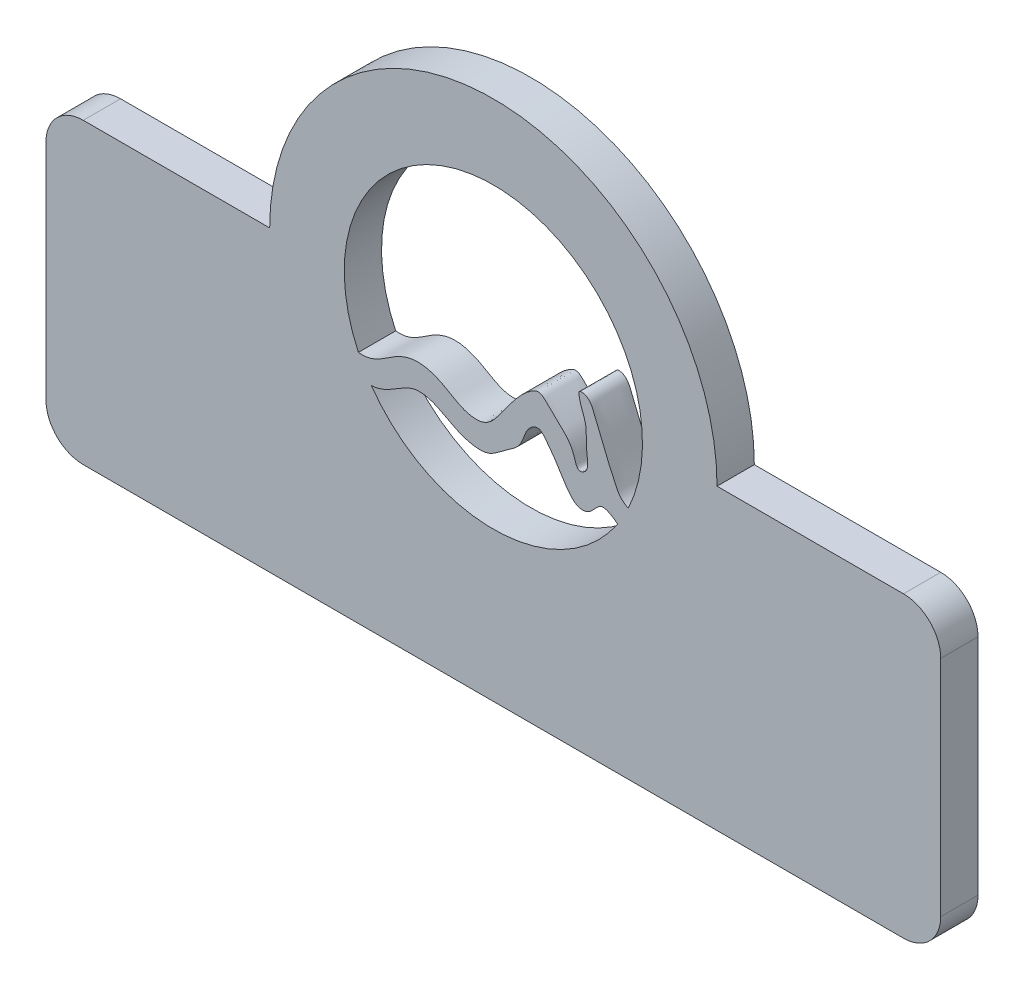
ISO-10303-21;
HEADER;
FILE_DESCRIPTION(('STEP AP214'),'2;1');
FILE_NAME('part.step','',(''),(''),'','','');
FILE_SCHEMA(('AUTOMOTIVE_DESIGN { 1 0 10303 214 1 1 1 1 }'));
ENDSEC;
DATA;
#1=APPLICATION_CONTEXT('core data for automotive mechanical design processes');
#2=APPLICATION_PROTOCOL_DEFINITION('international standard','automotive_design',2000,#1);
#3=PRODUCT_CONTEXT('',#1,'mechanical');
#4=PRODUCT('Part','Part','',(#3));
#5=PRODUCT_RELATED_PRODUCT_CATEGORY('part','',(#4));
#6=PRODUCT_DEFINITION_FORMATION('','',#4);
#7=PRODUCT_DEFINITION_CONTEXT('part definition',#1,'design');
#8=PRODUCT_DEFINITION('design','',#6,#7);
#9=PRODUCT_DEFINITION_SHAPE('','',#8);
#10=(LENGTH_UNIT() NAMED_UNIT(*) SI_UNIT(.MILLI.,.METRE.));
#11=(NAMED_UNIT(*) PLANE_ANGLE_UNIT() SI_UNIT($,.RADIAN.));
#12=(NAMED_UNIT(*) SI_UNIT($,.STERADIAN.) SOLID_ANGLE_UNIT());
#13=UNCERTAINTY_MEASURE_WITH_UNIT(LENGTH_MEASURE(1.E-05),#10,'distance_accuracy_value','');
#14=(GEOMETRIC_REPRESENTATION_CONTEXT(3) GLOBAL_UNCERTAINTY_ASSIGNED_CONTEXT((#13)) GLOBAL_UNIT_ASSIGNED_CONTEXT((#10,
#11,#12)) REPRESENTATION_CONTEXT('',''));
#15=CARTESIAN_POINT('',(0.,0.,0.));
#16=DIRECTION('',(0.,0.,1.));
#17=DIRECTION('',(1.,0.,0.));
#18=AXIS2_PLACEMENT_3D('',#15,#16,#17);
#19=CARTESIAN_POINT('',(16.7353149695587,16.1394582768876,3.175));
#20=DIRECTION('',(0.,0.,1.));
#21=DIRECTION('',(1.,0.,0.));
#22=AXIS2_PLACEMENT_3D('',#19,#20,#21);
#23=PLANE('',#22);
#24=CARTESIAN_POINT('',(16.7353149695587,16.1394582768876,3.175));
#25=DIRECTION('',(0.,0.,1.));
#26=DIRECTION('',(1.,0.,0.));
#27=AXIS2_PLACEMENT_3D('',#24,#25,#26);
#28=CIRCLE('',#27,12.7);
#29=CARTESIAN_POINT('',(28.2284558404309,10.7359674679487,3.175));
#30=VERTEX_POINT('',#29);
#31=CARTESIAN_POINT('',(5.24217409868645,10.7359674679487,3.175));
#32=VERTEX_POINT('',#31);
#33=EDGE_CURVE('E172',#30,#32,#28,.T.);
#34=ORIENTED_EDGE('',*,*,#33,.F.);
#35=CARTESIAN_POINT('',(5.24217409868645,10.7359674679487,3.175));
#36=CARTESIAN_POINT('',(6.71809569007158,10.5583363116698,3.175));
#37=CARTESIAN_POINT('',(7.9181175137713,12.0334760895931,3.175));
#38=CARTESIAN_POINT('',(10.468854721958,12.7659447435013,3.175));
#39=CARTESIAN_POINT('',(12.4429037284296,12.0981408705217,3.175));
#40=CARTESIAN_POINT('',(14.0399826679159,10.9310546034412,3.175));
#41=CARTESIAN_POINT('',(16.2263714118939,10.6185513462935,3.175));
#42=CARTESIAN_POINT('',(17.4991508982318,12.5178776573258,3.175));
#43=CARTESIAN_POINT('',(18.6877190372775,14.1014583521492,3.175));
#44=CARTESIAN_POINT('',(19.6579399153575,15.1072457767917,3.175));
#45=CARTESIAN_POINT('',(20.7365942091424,15.6711403370614,3.175));
#46=CARTESIAN_POINT('',(21.5924143850138,14.6574307728109,3.175));
#47=CARTESIAN_POINT('',(22.7185605146398,13.7475085461238,3.175));
#48=CARTESIAN_POINT('',(23.5698295134374,12.7032800384112,3.175));
#49=CARTESIAN_POINT('',(23.8625939485116,11.2745807664498,3.175));
#50=CARTESIAN_POINT('',(24.9533623804991,11.6978195279501,3.175));
#51=CARTESIAN_POINT('',(24.5406586001507,13.3497868624274,3.175));
#52=CARTESIAN_POINT('',(24.8082580394684,15.1397570692778,3.175));
#53=CARTESIAN_POINT('',(24.0950168556002,16.3011618970305,3.175));
#54=CARTESIAN_POINT('',(23.998924349624,17.331566415853,3.175));
#55=CARTESIAN_POINT('',(24.9340287374693,17.3133291685318,3.175));
#56=CARTESIAN_POINT('',(25.3682131220015,16.0394970111106,3.175));
#57=CARTESIAN_POINT('',(25.9914607242334,14.7264604105497,3.175));
#58=CARTESIAN_POINT('',(26.4067642072258,13.484600274914,3.175));
#59=CARTESIAN_POINT('',(27.1285210517247,12.1460637718713,3.175));
#60=CARTESIAN_POINT('',(27.3699983663483,11.1039666920429,3.175));
#61=CARTESIAN_POINT('',(28.2284558404309,10.7359674679487,3.175));
#62=B_SPLINE_CURVE_WITH_KNOTS('',3,(#35,#36,#37,#38,#39,#40,#41,#42,#43,#44,#45,#46,#47,#48,#49,
#50,#51,#52,#53,#54,#55,#56,#57,#58,#59,#60,#61),.UNSPECIFIED.,.F.,.F.,(4,1,1,1,1,1,1,1,1,1,1,1,
1,1,1,1,1,1,1,1,1,1,1,1,4),(0.,0.103449194536741,0.139241600743804,0.205578261756407,
0.258601603271188,0.299465828186436,0.363653171051923,0.418235104391856,0.461509401392811,
0.476757705922729,0.506042885966889,0.548409229610876,0.597041834513843,0.622241462987159,
0.632003189668546,0.675047866330173,0.726967039234851,0.779124265533172,0.786558575085862,
0.795901317613981,0.835776716059717,0.878715552765477,0.917236667041862,0.938498415893101,1.),.UNSPECIFIED.);
#63=EDGE_CURVE('E188',#32,#30,#62,.T.);
#64=ORIENTED_EDGE('',*,*,#63,.F.);
#65=EDGE_LOOP('',(#34,#64));
#66=FACE_BOUND('',#65,.T.);
#67=DIRECTION('',(0.,1.,0.));
#68=VECTOR('',#67,1.);
#69=CARTESIAN_POINT('',(54.8353149695587,-9.26054172311241,3.175));
#70=LINE('',#69,#68);
#71=CARTESIAN_POINT('',(54.8353149695587,-6.08554172311241,3.175));
#72=VERTEX_POINT('',#71);
#73=CARTESIAN_POINT('',(54.8353149695587,12.9644582768876,3.175));
#74=VERTEX_POINT('',#73);
#75=EDGE_CURVE('E267',#72,#74,#70,.T.);
#76=ORIENTED_EDGE('',*,*,#75,.T.);
#77=CARTESIAN_POINT('',(51.6603149695587,12.9644582768876,3.175));
#78=DIRECTION('',(0.,0.,1.));
#79=DIRECTION('',(1.,0.,0.));
#80=AXIS2_PLACEMENT_3D('',#77,#78,#79);
#81=CIRCLE('',#80,3.175);
#82=CARTESIAN_POINT('',(51.6603149695587,16.1394582768876,3.175));
#83=VERTEX_POINT('',#82);
#84=EDGE_CURVE('E333',#74,#83,#81,.T.);
#85=ORIENTED_EDGE('',*,*,#84,.T.);
#86=DIRECTION('',(-1.,0.,0.));
#87=VECTOR('',#86,1.);
#88=CARTESIAN_POINT('',(35.7853149695587,16.1394582768876,3.175));
#89=LINE('',#88,#87);
#90=CARTESIAN_POINT('',(35.7853149695587,16.1394582768876,3.175));
#91=VERTEX_POINT('',#90);
#92=EDGE_CURVE('E271',#83,#91,#89,.T.);
#93=ORIENTED_EDGE('',*,*,#92,.T.);
#94=CARTESIAN_POINT('',(16.7353149695587,16.1394582768876,3.175));
#95=DIRECTION('',(0.,0.,1.));
#96=DIRECTION('',(1.,0.,0.));
#97=AXIS2_PLACEMENT_3D('',#94,#95,#96);
#98=CIRCLE('',#97,19.05);
#99=CARTESIAN_POINT('',(-2.31468503044133,16.1394582768876,3.175));
#100=VERTEX_POINT('',#99);
#101=EDGE_CURVE('E252',#91,#100,#98,.T.);
#102=ORIENTED_EDGE('',*,*,#101,.T.);
#103=DIRECTION('',(-1.,0.,0.));
#104=VECTOR('',#103,1.);
#105=CARTESIAN_POINT('',(-21.3646850304413,16.1394582768876,3.175));
#106=LINE('',#105,#104);
#107=CARTESIAN_POINT('',(-18.1896850304413,16.1394582768876,3.175));
#108=VERTEX_POINT('',#107);
#109=EDGE_CURVE('E256',#100,#108,#106,.T.);
#110=ORIENTED_EDGE('',*,*,#109,.T.);
#111=CARTESIAN_POINT('',(-18.1896850304413,12.9644582768876,3.175));
#112=DIRECTION('',(0.,0.,1.));
#113=DIRECTION('',(1.,0.,0.));
#114=AXIS2_PLACEMENT_3D('',#111,#112,#113);
#115=CIRCLE('',#114,3.175);
#116=CARTESIAN_POINT('',(-21.3646850304413,12.9644582768876,3.175));
#117=VERTEX_POINT('',#116);
#118=EDGE_CURVE('E325',#108,#117,#115,.T.);
#119=ORIENTED_EDGE('',*,*,#118,.T.);
#120=DIRECTION('',(0.,-1.,0.));
#121=VECTOR('',#120,1.);
#122=CARTESIAN_POINT('',(-21.3646850304413,-9.26054172311241,3.175));
#123=LINE('',#122,#121);
#124=CARTESIAN_POINT('',(-21.3646850304413,-6.08554172311241,3.175));
#125=VERTEX_POINT('',#124);
#126=EDGE_CURVE('E261',#117,#125,#123,.T.);
#127=ORIENTED_EDGE('',*,*,#126,.T.);
#128=CARTESIAN_POINT('',(-18.1896850304413,-6.08554172311241,3.175));
#129=DIRECTION('',(0.,0.,1.));
#130=DIRECTION('',(1.,0.,0.));
#131=AXIS2_PLACEMENT_3D('',#128,#129,#130);
#132=CIRCLE('',#131,3.175);
#133=CARTESIAN_POINT('',(-18.1896850304413,-9.26054172311241,3.175));
#134=VERTEX_POINT('',#133);
#135=EDGE_CURVE('E86',#125,#134,#132,.T.);
#136=ORIENTED_EDGE('',*,*,#135,.T.);
#137=DIRECTION('',(1.,0.,0.));
#138=VECTOR('',#137,1.);
#139=CARTESIAN_POINT('',(-21.3646850304413,-9.26054172311241,3.175));
#140=LINE('',#139,#138);
#141=CARTESIAN_POINT('',(51.6603149695586,-9.26054172311241,3.175));
#142=VERTEX_POINT('',#141);
#143=EDGE_CURVE('E264',#134,#142,#140,.T.);
#144=ORIENTED_EDGE('',*,*,#143,.T.);
#145=CARTESIAN_POINT('',(51.6603149695587,-6.08554172311241,3.175));
#146=DIRECTION('',(0.,0.,1.));
#147=DIRECTION('',(1.,0.,0.));
#148=AXIS2_PLACEMENT_3D('',#145,#146,#147);
#149=CIRCLE('',#148,3.175);
#150=EDGE_CURVE('E330',#142,#72,#149,.T.);
#151=ORIENTED_EDGE('',*,*,#150,.T.);
#152=EDGE_LOOP('',(#76,#85,#93,#102,#110,#119,#127,#136,#144,#151));
#153=FACE_BOUND('',#152,.T.);
#154=CARTESIAN_POINT('',(16.7353149695587,16.1394582768876,3.175));
#155=DIRECTION('',(0.,0.,1.));
#156=DIRECTION('',(1.,0.,0.));
#157=AXIS2_PLACEMENT_3D('',#154,#155,#156);
#158=CIRCLE('',#157,12.7);
#159=CARTESIAN_POINT('',(6.34133551897178,8.84184283204687,3.175));
#160=VERTEX_POINT('',#159);
#161=CARTESIAN_POINT('',(27.3242227262045,9.1276801485349,3.175));
#162=VERTEX_POINT('',#161);
#163=EDGE_CURVE('E224',#160,#162,#158,.T.);
#164=ORIENTED_EDGE('',*,*,#163,.F.);
#165=CARTESIAN_POINT('',(6.34133551897178,8.84184283204687,3.175));
#166=CARTESIAN_POINT('',(7.35294883387056,8.8927655582152,3.175));
#167=CARTESIAN_POINT('',(8.43974754301574,9.7203705737948,3.175));
#168=CARTESIAN_POINT('',(10.0783228223503,10.5482821721267,3.175));
#169=CARTESIAN_POINT('',(11.6015791581696,10.3367737163733,3.175));
#170=CARTESIAN_POINT('',(13.0104182815705,9.47926217741116,3.175));
#171=CARTESIAN_POINT('',(14.602994521296,8.76006985247678,3.175));
#172=CARTESIAN_POINT('',(16.3538518180501,8.62724276321637,3.175));
#173=CARTESIAN_POINT('',(17.6380599917219,9.77696458158076,3.175));
#174=CARTESIAN_POINT('',(19.2522117450946,10.6455361542986,3.175));
#175=CARTESIAN_POINT('',(19.4083323897573,12.251159056738,3.175));
#176=CARTESIAN_POINT('',(20.6019471994809,13.020559931285,3.175));
#177=CARTESIAN_POINT('',(21.5067328588053,11.9378281641538,3.175));
#178=CARTESIAN_POINT('',(22.2898184042684,10.7944864499648,3.175));
#179=CARTESIAN_POINT('',(23.0330176474701,9.45522683601884,3.175));
#180=CARTESIAN_POINT('',(23.9851834372349,8.54138472112722,3.175));
#181=CARTESIAN_POINT('',(25.1785216720955,8.78363175224099,3.175));
#182=CARTESIAN_POINT('',(25.8580537064909,10.2363822765137,3.175));
#183=CARTESIAN_POINT('',(27.0204413215573,9.32676808646791,3.175));
#184=CARTESIAN_POINT('',(27.3242227262045,9.12768014853491,3.175));
#185=B_SPLINE_CURVE_WITH_KNOTS('',3,(#165,#166,#167,#168,#169,#170,#171,#172,#173,#174,#175,
#176,#177,#178,#179,#180,#181,#182,#183,#184),.UNSPECIFIED.,.F.,.F.,(4,1,1,1,1,1,1,1,1,1,1,1,1,
1,1,1,1,4),(0.,0.111111505566851,0.158804473380793,0.207674807266992,0.281442738283734,
0.34935856682418,0.412439169497565,0.469148104339875,0.544608442597345,0.60989685081648,
0.643348875048428,0.677969983838984,0.748784790603051,0.815450655637724,0.85672693430683,
0.888904638615788,0.94263122219289,1.),.UNSPECIFIED.);
#186=EDGE_CURVE('E233',#160,#162,#185,.T.);
#187=ORIENTED_EDGE('',*,*,#186,.T.);
#188=EDGE_LOOP('',(#164,#187));
#189=FACE_BOUND('',#188,.T.);
#190=ADVANCED_FACE('F63',(#66,#153,#189),#23,.T.);
#191=CARTESIAN_POINT('',(16.7353149695587,16.1394582768876,0.));
#192=DIRECTION('',(0.,0.,1.));
#193=DIRECTION('',(1.,0.,0.));
#194=AXIS2_PLACEMENT_3D('',#191,#192,#193);
#195=PLANE('',#194);
#196=CARTESIAN_POINT('',(5.24217409868645,10.7359674679487,0.));
#197=CARTESIAN_POINT('',(6.71809569007158,10.5583363116698,0.));
#198=CARTESIAN_POINT('',(7.9181175137713,12.0334760895931,0.));
#199=CARTESIAN_POINT('',(10.468854721958,12.7659447435013,0.));
#200=CARTESIAN_POINT('',(12.4429037284296,12.0981408705217,0.));
#201=CARTESIAN_POINT('',(14.0399826679159,10.9310546034412,0.));
#202=CARTESIAN_POINT('',(16.2263714118939,10.6185513462935,0.));
#203=CARTESIAN_POINT('',(17.4991508982318,12.5178776573258,0.));
#204=CARTESIAN_POINT('',(18.6877190372775,14.1014583521492,0.));
#205=CARTESIAN_POINT('',(19.6579399153575,15.1072457767917,0.));
#206=CARTESIAN_POINT('',(20.7365942091424,15.6711403370614,0.));
#207=CARTESIAN_POINT('',(21.5924143850138,14.6574307728109,0.));
#208=CARTESIAN_POINT('',(22.7185605146398,13.7475085461238,0.));
#209=CARTESIAN_POINT('',(23.5698295134374,12.7032800384112,0.));
#210=CARTESIAN_POINT('',(23.8625939485116,11.2745807664498,0.));
#211=CARTESIAN_POINT('',(24.9533623804991,11.6978195279501,0.));
#212=CARTESIAN_POINT('',(24.5406586001507,13.3497868624274,0.));
#213=CARTESIAN_POINT('',(24.8082580394684,15.1397570692778,0.));
#214=CARTESIAN_POINT('',(24.0950168556002,16.3011618970305,0.));
#215=CARTESIAN_POINT('',(23.998924349624,17.331566415853,0.));
#216=CARTESIAN_POINT('',(24.9340287374693,17.3133291685318,0.));
#217=CARTESIAN_POINT('',(25.3682131220015,16.0394970111106,0.));
#218=CARTESIAN_POINT('',(25.9914607242334,14.7264604105497,0.));
#219=CARTESIAN_POINT('',(26.4067642072258,13.484600274914,0.));
#220=CARTESIAN_POINT('',(27.1285210517247,12.1460637718713,0.));
#221=CARTESIAN_POINT('',(27.3699983663483,11.1039666920429,0.));
#222=CARTESIAN_POINT('',(28.2284558404309,10.7359674679487,0.));
#223=B_SPLINE_CURVE_WITH_KNOTS('',3,(#196,#197,#198,#199,#200,#201,#202,#203,#204,#205,#206,
#207,#208,#209,#210,#211,#212,#213,#214,#215,#216,#217,#218,#219,#220,#221,#222),.UNSPECIFIED.,
.F.,.F.,(4,1,1,1,1,1,1,1,1,1,1,1,1,1,1,1,1,1,1,1,1,1,1,1,4),(0.,0.103449194536741,
0.139241600743804,0.205578261756407,0.258601603271188,0.299465828186436,0.363653171051923,
0.418235104391856,0.461509401392811,0.476757705922729,0.506042885966889,0.548409229610876,
0.597041834513843,0.622241462987159,0.632003189668546,0.675047866330173,0.726967039234851,
0.779124265533172,0.786558575085862,0.795901317613981,0.835776716059717,0.878715552765477,
0.917236667041862,0.938498415893101,1.),.UNSPECIFIED.);
#224=CARTESIAN_POINT('',(5.24217409868645,10.7359674679487,0.));
#225=VERTEX_POINT('',#224);
#226=CARTESIAN_POINT('',(28.2284558404309,10.7359674679487,0.));
#227=VERTEX_POINT('',#226);
#228=EDGE_CURVE('E178',#225,#227,#223,.T.);
#229=ORIENTED_EDGE('',*,*,#228,.T.);
#230=CARTESIAN_POINT('',(16.7353149695587,16.1394582768876,0.));
#231=DIRECTION('',(0.,0.,1.));
#232=DIRECTION('',(1.,0.,0.));
#233=AXIS2_PLACEMENT_3D('',#230,#231,#232);
#234=CIRCLE('',#233,12.7);
#235=EDGE_CURVE('E169',#227,#225,#234,.T.);
#236=ORIENTED_EDGE('',*,*,#235,.T.);
#237=EDGE_LOOP('',(#229,#236));
#238=FACE_BOUND('',#237,.T.);
#239=DIRECTION('',(-1.,0.,0.));
#240=VECTOR('',#239,1.);
#241=CARTESIAN_POINT('',(35.7853149695587,16.1394582768876,0.));
#242=LINE('',#241,#240);
#243=CARTESIAN_POINT('',(51.6603149695587,16.1394582768876,0.));
#244=VERTEX_POINT('',#243);
#245=CARTESIAN_POINT('',(35.7853149695587,16.1394582768876,0.));
#246=VERTEX_POINT('',#245);
#247=EDGE_CURVE('E257',#244,#246,#242,.T.);
#248=ORIENTED_EDGE('',*,*,#247,.F.);
#249=CARTESIAN_POINT('',(51.6603149695587,12.9644582768876,0.));
#250=DIRECTION('',(0.,0.,1.));
#251=DIRECTION('',(1.,0.,0.));
#252=AXIS2_PLACEMENT_3D('',#249,#250,#251);
#253=CIRCLE('',#252,3.175);
#254=CARTESIAN_POINT('',(54.8353149695587,12.9644582768876,0.));
#255=VERTEX_POINT('',#254);
#256=EDGE_CURVE('E315',#244,#255,#253,.F.);
#257=ORIENTED_EDGE('',*,*,#256,.T.);
#258=DIRECTION('',(0.,1.,0.));
#259=VECTOR('',#258,1.);
#260=CARTESIAN_POINT('',(54.8353149695587,-9.26054172311241,0.));
#261=LINE('',#260,#259);
#262=CARTESIAN_POINT('',(54.8353149695587,-6.08554172311241,0.));
#263=VERTEX_POINT('',#262);
#264=EDGE_CURVE('E289',#263,#255,#261,.T.);
#265=ORIENTED_EDGE('',*,*,#264,.F.);
#266=CARTESIAN_POINT('',(51.6603149695587,-6.08554172311241,0.));
#267=DIRECTION('',(0.,0.,1.));
#268=DIRECTION('',(1.,0.,0.));
#269=AXIS2_PLACEMENT_3D('',#266,#267,#268);
#270=CIRCLE('',#269,3.175);
#271=CARTESIAN_POINT('',(51.6603149695586,-9.26054172311241,0.));
#272=VERTEX_POINT('',#271);
#273=EDGE_CURVE('E312',#263,#272,#270,.F.);
#274=ORIENTED_EDGE('',*,*,#273,.T.);
#275=DIRECTION('',(1.,0.,0.));
#276=VECTOR('',#275,1.);
#277=CARTESIAN_POINT('',(-21.3646850304413,-9.26054172311241,0.));
#278=LINE('',#277,#276);
#279=CARTESIAN_POINT('',(-18.1896850304413,-9.26054172311241,0.));
#280=VERTEX_POINT('',#279);
#281=EDGE_CURVE('E286',#280,#272,#278,.T.);
#282=ORIENTED_EDGE('',*,*,#281,.F.);
#283=CARTESIAN_POINT('',(-18.1896850304413,-6.08554172311241,0.));
#284=DIRECTION('',(0.,0.,1.));
#285=DIRECTION('',(1.,0.,0.));
#286=AXIS2_PLACEMENT_3D('',#283,#284,#285);
#287=CIRCLE('',#286,3.175);
#288=CARTESIAN_POINT('',(-21.3646850304413,-6.08554172311241,0.));
#289=VERTEX_POINT('',#288);
#290=EDGE_CURVE('E309',#280,#289,#287,.F.);
#291=ORIENTED_EDGE('',*,*,#290,.T.);
#292=DIRECTION('',(0.,-1.,0.));
#293=VECTOR('',#292,1.);
#294=CARTESIAN_POINT('',(-21.3646850304413,-9.26054172311241,0.));
#295=LINE('',#294,#293);
#296=CARTESIAN_POINT('',(-21.3646850304413,12.9644582768876,0.));
#297=VERTEX_POINT('',#296);
#298=EDGE_CURVE('E282',#297,#289,#295,.T.);
#299=ORIENTED_EDGE('',*,*,#298,.F.);
#300=CARTESIAN_POINT('',(-18.1896850304413,12.9644582768876,0.));
#301=DIRECTION('',(0.,0.,1.));
#302=DIRECTION('',(1.,0.,0.));
#303=AXIS2_PLACEMENT_3D('',#300,#301,#302);
#304=CIRCLE('',#303,3.175);
#305=CARTESIAN_POINT('',(-18.1896850304413,16.1394582768876,0.));
#306=VERTEX_POINT('',#305);
#307=EDGE_CURVE('E306',#297,#306,#304,.F.);
#308=ORIENTED_EDGE('',*,*,#307,.T.);
#309=DIRECTION('',(-1.,0.,0.));
#310=VECTOR('',#309,1.);
#311=CARTESIAN_POINT('',(-21.3646850304413,16.1394582768876,0.));
#312=LINE('',#311,#310);
#313=CARTESIAN_POINT('',(-2.31468503044133,16.1394582768876,0.));
#314=VERTEX_POINT('',#313);
#315=EDGE_CURVE('E278',#314,#306,#312,.T.);
#316=ORIENTED_EDGE('',*,*,#315,.F.);
#317=CARTESIAN_POINT('',(16.7353149695587,16.1394582768876,0.));
#318=DIRECTION('',(0.,0.,1.));
#319=DIRECTION('',(1.,0.,0.));
#320=AXIS2_PLACEMENT_3D('',#317,#318,#319);
#321=CIRCLE('',#320,19.05);
#322=EDGE_CURVE('E251',#246,#314,#321,.T.);
#323=ORIENTED_EDGE('',*,*,#322,.F.);
#324=EDGE_LOOP('',(#248,#257,#265,#274,#282,#291,#299,#308,#316,#323));
#325=FACE_BOUND('',#324,.T.);
#326=CARTESIAN_POINT('',(6.34133551897178,8.84184283204687,0.));
#327=CARTESIAN_POINT('',(7.35294883387056,8.8927655582152,0.));
#328=CARTESIAN_POINT('',(8.43974754301574,9.7203705737948,0.));
#329=CARTESIAN_POINT('',(10.0783228223503,10.5482821721267,0.));
#330=CARTESIAN_POINT('',(11.6015791581696,10.3367737163733,0.));
#331=CARTESIAN_POINT('',(13.0104182815705,9.47926217741116,0.));
#332=CARTESIAN_POINT('',(14.602994521296,8.76006985247678,0.));
#333=CARTESIAN_POINT('',(16.3538518180501,8.62724276321637,0.));
#334=CARTESIAN_POINT('',(17.6380599917219,9.77696458158076,0.));
#335=CARTESIAN_POINT('',(19.2522117450946,10.6455361542986,0.));
#336=CARTESIAN_POINT('',(19.4083323897573,12.251159056738,0.));
#337=CARTESIAN_POINT('',(20.6019471994809,13.020559931285,0.));
#338=CARTESIAN_POINT('',(21.5067328588053,11.9378281641538,0.));
#339=CARTESIAN_POINT('',(22.2898184042684,10.7944864499648,0.));
#340=CARTESIAN_POINT('',(23.0330176474701,9.45522683601884,0.));
#341=CARTESIAN_POINT('',(23.9851834372349,8.54138472112722,0.));
#342=CARTESIAN_POINT('',(25.1785216720955,8.78363175224099,0.));
#343=CARTESIAN_POINT('',(25.8580537064909,10.2363822765137,0.));
#344=CARTESIAN_POINT('',(27.0204413215573,9.32676808646791,0.));
#345=CARTESIAN_POINT('',(27.3242227262045,9.12768014853491,0.));
#346=B_SPLINE_CURVE_WITH_KNOTS('',3,(#326,#327,#328,#329,#330,#331,#332,#333,#334,#335,#336,
#337,#338,#339,#340,#341,#342,#343,#344,#345),.UNSPECIFIED.,.F.,.F.,(4,1,1,1,1,1,1,1,1,1,1,1,1,
1,1,1,1,4),(0.,0.111111505566851,0.158804473380793,0.207674807266992,0.281442738283734,
0.34935856682418,0.412439169497565,0.469148104339875,0.544608442597345,0.60989685081648,
0.643348875048428,0.677969983838984,0.748784790603051,0.815450655637724,0.85672693430683,
0.888904638615788,0.94263122219289,1.),.UNSPECIFIED.);
#347=CARTESIAN_POINT('',(6.34133551897178,8.84184283204687,0.));
#348=VERTEX_POINT('',#347);
#349=CARTESIAN_POINT('',(27.3242227262045,9.1276801485349,0.));
#350=VERTEX_POINT('',#349);
#351=EDGE_CURVE('E216',#348,#350,#346,.T.);
#352=ORIENTED_EDGE('',*,*,#351,.F.);
#353=CARTESIAN_POINT('',(16.7353149695587,16.1394582768876,0.));
#354=DIRECTION('',(0.,0.,1.));
#355=DIRECTION('',(1.,0.,0.));
#356=AXIS2_PLACEMENT_3D('',#353,#354,#355);
#357=CIRCLE('',#356,12.7);
#358=EDGE_CURVE('E223',#348,#350,#357,.T.);
#359=ORIENTED_EDGE('',*,*,#358,.T.);
#360=EDGE_LOOP('',(#352,#359));
#361=FACE_BOUND('',#360,.T.);
#362=ADVANCED_FACE('F185',(#238,#325,#361),#195,.F.);
#363=CARTESIAN_POINT('',(16.7353149695587,16.1394582768876,3.175));
#364=DIRECTION('',(0.,0.,-1.));
#365=DIRECTION('',(-1.,0.,0.));
#366=AXIS2_PLACEMENT_3D('',#363,#364,#365);
#367=CYLINDRICAL_SURFACE('',#366,19.05);
#368=ORIENTED_EDGE('',*,*,#322,.T.);
#369=DIRECTION('',(0.,0.,-1.));
#370=VECTOR('',#369,1.);
#371=CARTESIAN_POINT('',(-2.31468503044133,16.1394582768876,3.175));
#372=LINE('',#371,#370);
#373=EDGE_CURVE('E298',#100,#314,#372,.T.);
#374=ORIENTED_EDGE('',*,*,#373,.F.);
#375=ORIENTED_EDGE('',*,*,#101,.F.);
#376=DIRECTION('',(0.,0.,-1.));
#377=VECTOR('',#376,1.);
#378=CARTESIAN_POINT('',(35.7853149695587,16.1394582768876,3.175));
#379=LINE('',#378,#377);
#380=EDGE_CURVE('E274',#91,#246,#379,.T.);
#381=ORIENTED_EDGE('',*,*,#380,.T.);
#382=EDGE_LOOP('',(#368,#374,#375,#381));
#383=FACE_BOUND('',#382,.T.);
#384=ADVANCED_FACE('F379',(#383),#367,.T.);
#385=CARTESIAN_POINT('',(-21.3646850304413,16.1394582768876,3.175));
#386=DIRECTION('',(0.,-1.,0.));
#387=DIRECTION('',(0.,0.,-1.));
#388=AXIS2_PLACEMENT_3D('',#385,#386,#387);
#389=PLANE('',#388);
#390=ORIENTED_EDGE('',*,*,#315,.T.);
#391=DIRECTION('',(0.,0.,-1.));
#392=VECTOR('',#391,1.);
#393=CARTESIAN_POINT('',(-18.1896850304413,16.1394582768876,3.175));
#394=LINE('',#393,#392);
#395=EDGE_CURVE('E12',#306,#108,#394,.F.);
#396=ORIENTED_EDGE('',*,*,#395,.T.);
#397=ORIENTED_EDGE('',*,*,#109,.F.);
#398=ORIENTED_EDGE('',*,*,#373,.T.);
#399=EDGE_LOOP('',(#390,#396,#397,#398));
#400=FACE_BOUND('',#399,.T.);
#401=ADVANCED_FACE('F384',(#400),#389,.F.);
#402=CARTESIAN_POINT('',(-21.3646850304413,-9.26054172311241,3.175));
#403=DIRECTION('',(1.,0.,0.));
#404=DIRECTION('',(0.,0.,-1.));
#405=AXIS2_PLACEMENT_3D('',#402,#403,#404);
#406=PLANE('',#405);
#407=ORIENTED_EDGE('',*,*,#298,.T.);
#408=DIRECTION('',(0.,0.,-1.));
#409=VECTOR('',#408,1.);
#410=CARTESIAN_POINT('',(-21.3646850304413,-6.08554172311241,3.175));
#411=LINE('',#410,#409);
#412=EDGE_CURVE('E72',#289,#125,#411,.F.);
#413=ORIENTED_EDGE('',*,*,#412,.T.);
#414=ORIENTED_EDGE('',*,*,#126,.F.);
#415=DIRECTION('',(0.,0.,-1.));
#416=VECTOR('',#415,1.);
#417=CARTESIAN_POINT('',(-21.3646850304413,12.9644582768876,3.175));
#418=LINE('',#417,#416);
#419=EDGE_CURVE('E342',#117,#297,#418,.T.);
#420=ORIENTED_EDGE('',*,*,#419,.T.);
#421=EDGE_LOOP('',(#407,#413,#414,#420));
#422=FACE_BOUND('',#421,.T.);
#423=ADVANCED_FACE('F349',(#422),#406,.F.);
#424=CARTESIAN_POINT('',(-21.3646850304413,-9.26054172311241,3.175));
#425=DIRECTION('',(0.,1.,0.));
#426=DIRECTION('',(0.,0.,1.));
#427=AXIS2_PLACEMENT_3D('',#424,#425,#426);
#428=PLANE('',#427);
#429=ORIENTED_EDGE('',*,*,#281,.T.);
#430=DIRECTION('',(0.,0.,-1.));
#431=VECTOR('',#430,1.);
#432=CARTESIAN_POINT('',(51.6603149695587,-9.26054172311241,3.175));
#433=LINE('',#432,#431);
#434=EDGE_CURVE('E79',#272,#142,#433,.F.);
#435=ORIENTED_EDGE('',*,*,#434,.T.);
#436=ORIENTED_EDGE('',*,*,#143,.F.);
#437=DIRECTION('',(0.,0.,-1.));
#438=VECTOR('',#437,1.);
#439=CARTESIAN_POINT('',(-18.1896850304413,-9.26054172311241,3.175));
#440=LINE('',#439,#438);
#441=EDGE_CURVE('E336',#134,#280,#440,.T.);
#442=ORIENTED_EDGE('',*,*,#441,.T.);
#443=EDGE_LOOP('',(#429,#435,#436,#442));
#444=FACE_BOUND('',#443,.T.);
#445=ADVANCED_FACE('F358',(#444),#428,.F.);
#446=CARTESIAN_POINT('',(54.8353149695587,-9.26054172311241,3.175));
#447=DIRECTION('',(-1.,0.,0.));
#448=DIRECTION('',(0.,0.,1.));
#449=AXIS2_PLACEMENT_3D('',#446,#447,#448);
#450=PLANE('',#449);
#451=ORIENTED_EDGE('',*,*,#264,.T.);
#452=DIRECTION('',(0.,0.,-1.));
#453=VECTOR('',#452,1.);
#454=CARTESIAN_POINT('',(54.8353149695587,12.9644582768876,3.175));
#455=LINE('',#454,#453);
#456=EDGE_CURVE('E322',#255,#74,#455,.F.);
#457=ORIENTED_EDGE('',*,*,#456,.T.);
#458=ORIENTED_EDGE('',*,*,#75,.F.);
#459=DIRECTION('',(0.,0.,-1.));
#460=VECTOR('',#459,1.);
#461=CARTESIAN_POINT('',(54.8353149695587,-6.08554172311241,3.175));
#462=LINE('',#461,#460);
#463=EDGE_CURVE('E318',#72,#263,#462,.T.);
#464=ORIENTED_EDGE('',*,*,#463,.T.);
#465=EDGE_LOOP('',(#451,#457,#458,#464));
#466=FACE_BOUND('',#465,.T.);
#467=ADVANCED_FACE('F368',(#466),#450,.F.);
#468=CARTESIAN_POINT('',(35.7853149695587,16.1394582768876,3.175));
#469=DIRECTION('',(0.,-1.,0.));
#470=DIRECTION('',(0.,0.,-1.));
#471=AXIS2_PLACEMENT_3D('',#468,#469,#470);
#472=PLANE('',#471);
#473=ORIENTED_EDGE('',*,*,#92,.F.);
#474=DIRECTION('',(0.,0.,-1.));
#475=VECTOR('',#474,1.);
#476=CARTESIAN_POINT('',(51.6603149695587,16.1394582768876,3.175));
#477=LINE('',#476,#475);
#478=EDGE_CURVE('E302',#83,#244,#477,.T.);
#479=ORIENTED_EDGE('',*,*,#478,.T.);
#480=ORIENTED_EDGE('',*,*,#247,.T.);
#481=ORIENTED_EDGE('',*,*,#380,.F.);
#482=EDGE_LOOP('',(#473,#479,#480,#481));
#483=FACE_BOUND('',#482,.T.);
#484=ADVANCED_FACE('F213',(#483),#472,.F.);
#485=DIRECTION('',(0.,0.,1.));
#486=VECTOR('',#485,1.);
#487=SURFACE_OF_LINEAR_EXTRUSION('',#346,#486);
#488=ORIENTED_EDGE('',*,*,#186,.F.);
#489=DIRECTION('',(0.,0.,1.));
#490=VECTOR('',#489,1.);
#491=CARTESIAN_POINT('',(6.34133551897178,8.84184283204687,0.));
#492=LINE('',#491,#490);
#493=EDGE_CURVE('E232',#348,#160,#492,.T.);
#494=ORIENTED_EDGE('',*,*,#493,.F.);
#495=ORIENTED_EDGE('',*,*,#351,.T.);
#496=DIRECTION('',(0.,0.,1.));
#497=VECTOR('',#496,1.);
#498=CARTESIAN_POINT('',(27.3242227262045,9.1276801485349,0.));
#499=LINE('',#498,#497);
#500=EDGE_CURVE('E248',#350,#162,#499,.T.);
#501=ORIENTED_EDGE('',*,*,#500,.T.);
#502=EDGE_LOOP('',(#488,#494,#495,#501));
#503=FACE_BOUND('',#502,.T.);
#504=ADVANCED_FACE('F208',(#503),#487,.T.);
#505=CARTESIAN_POINT('',(16.7353149695587,16.1394582768876,0.));
#506=DIRECTION('',(0.,0.,1.));
#507=DIRECTION('',(1.,0.,0.));
#508=AXIS2_PLACEMENT_3D('',#505,#506,#507);
#509=CYLINDRICAL_SURFACE('',#508,12.7);
#510=ORIENTED_EDGE('',*,*,#163,.T.);
#511=ORIENTED_EDGE('',*,*,#500,.F.);
#512=ORIENTED_EDGE('',*,*,#358,.F.);
#513=ORIENTED_EDGE('',*,*,#493,.T.);
#514=EDGE_LOOP('',(#510,#511,#512,#513));
#515=FACE_BOUND('',#514,.T.);
#516=ADVANCED_FACE('F205',(#515),#509,.F.);
#517=CARTESIAN_POINT('',(16.7353149695587,16.1394582768876,0.));
#518=DIRECTION('',(0.,0.,1.));
#519=DIRECTION('',(1.,0.,0.));
#520=AXIS2_PLACEMENT_3D('',#517,#518,#519);
#521=CYLINDRICAL_SURFACE('',#520,12.7);
#522=ORIENTED_EDGE('',*,*,#33,.T.);
#523=DIRECTION('',(0.,0.,1.));
#524=VECTOR('',#523,1.);
#525=CARTESIAN_POINT('',(5.24217409868645,10.7359674679487,0.));
#526=LINE('',#525,#524);
#527=EDGE_CURVE('E165',#225,#32,#526,.T.);
#528=ORIENTED_EDGE('',*,*,#527,.F.);
#529=ORIENTED_EDGE('',*,*,#235,.F.);
#530=DIRECTION('',(0.,0.,1.));
#531=VECTOR('',#530,1.);
#532=CARTESIAN_POINT('',(28.2284558404309,10.7359674679487,0.));
#533=LINE('',#532,#531);
#534=EDGE_CURVE('E177',#227,#30,#533,.T.);
#535=ORIENTED_EDGE('',*,*,#534,.T.);
#536=EDGE_LOOP('',(#522,#528,#529,#535));
#537=FACE_BOUND('',#536,.T.);
#538=ADVANCED_FACE('F167',(#537),#521,.F.);
#539=DIRECTION('',(0.,0.,1.));
#540=VECTOR('',#539,1.);
#541=SURFACE_OF_LINEAR_EXTRUSION('',#223,#540);
#542=ORIENTED_EDGE('',*,*,#63,.T.);
#543=ORIENTED_EDGE('',*,*,#534,.F.);
#544=ORIENTED_EDGE('',*,*,#228,.F.);
#545=ORIENTED_EDGE('',*,*,#527,.T.);
#546=EDGE_LOOP('',(#542,#543,#544,#545));
#547=FACE_BOUND('',#546,.T.);
#548=ADVANCED_FACE('F181',(#547),#541,.F.);
#549=CARTESIAN_POINT('',(51.6603149695587,12.9644582768876,3.175));
#550=DIRECTION('',(0.,0.,-1.));
#551=DIRECTION('',(-1.,0.,0.));
#552=AXIS2_PLACEMENT_3D('',#549,#550,#551);
#553=CYLINDRICAL_SURFACE('',#552,3.175);
#554=ORIENTED_EDGE('',*,*,#84,.F.);
#555=ORIENTED_EDGE('',*,*,#456,.F.);
#556=ORIENTED_EDGE('',*,*,#256,.F.);
#557=ORIENTED_EDGE('',*,*,#478,.F.);
#558=EDGE_LOOP('',(#554,#555,#556,#557));
#559=FACE_BOUND('',#558,.T.);
#560=ADVANCED_FACE('F202',(#559),#553,.T.);
#561=CARTESIAN_POINT('',(51.6603149695587,-6.08554172311241,3.175));
#562=DIRECTION('',(0.,0.,-1.));
#563=DIRECTION('',(-1.,0.,0.));
#564=AXIS2_PLACEMENT_3D('',#561,#562,#563);
#565=CYLINDRICAL_SURFACE('',#564,3.175);
#566=ORIENTED_EDGE('',*,*,#150,.F.);
#567=ORIENTED_EDGE('',*,*,#434,.F.);
#568=ORIENTED_EDGE('',*,*,#273,.F.);
#569=ORIENTED_EDGE('',*,*,#463,.F.);
#570=EDGE_LOOP('',(#566,#567,#568,#569));
#571=FACE_BOUND('',#570,.T.);
#572=ADVANCED_FACE('F365',(#571),#565,.T.);
#573=CARTESIAN_POINT('',(-18.1896850304413,-6.08554172311241,3.175));
#574=DIRECTION('',(0.,0.,-1.));
#575=DIRECTION('',(-1.,0.,0.));
#576=AXIS2_PLACEMENT_3D('',#573,#574,#575);
#577=CYLINDRICAL_SURFACE('',#576,3.175);
#578=ORIENTED_EDGE('',*,*,#135,.F.);
#579=ORIENTED_EDGE('',*,*,#412,.F.);
#580=ORIENTED_EDGE('',*,*,#290,.F.);
#581=ORIENTED_EDGE('',*,*,#441,.F.);
#582=EDGE_LOOP('',(#578,#579,#580,#581));
#583=FACE_BOUND('',#582,.T.);
#584=ADVANCED_FACE('F356',(#583),#577,.T.);
#585=CARTESIAN_POINT('',(-18.1896850304413,12.9644582768876,3.175));
#586=DIRECTION('',(0.,0.,-1.));
#587=DIRECTION('',(-1.,0.,0.));
#588=AXIS2_PLACEMENT_3D('',#585,#586,#587);
#589=CYLINDRICAL_SURFACE('',#588,3.175);
#590=ORIENTED_EDGE('',*,*,#118,.F.);
#591=ORIENTED_EDGE('',*,*,#395,.F.);
#592=ORIENTED_EDGE('',*,*,#307,.F.);
#593=ORIENTED_EDGE('',*,*,#419,.F.);
#594=EDGE_LOOP('',(#590,#591,#592,#593));
#595=FACE_BOUND('',#594,.T.);
#596=ADVANCED_FACE('F65',(#595),#589,.T.);
#597=CLOSED_SHELL('',(#190,#362,#384,#401,#423,#445,#467,#484,#504,#516,#538,#548,#560,#572,
#584,#596));
#598=MANIFOLD_SOLID_BREP('B2',#597);
#599=ADVANCED_BREP_SHAPE_REPRESENTATION('',(#18,#598),#14);
#600=SHAPE_DEFINITION_REPRESENTATION(#9,#599);
ENDSEC;
END-ISO-10303-21;
